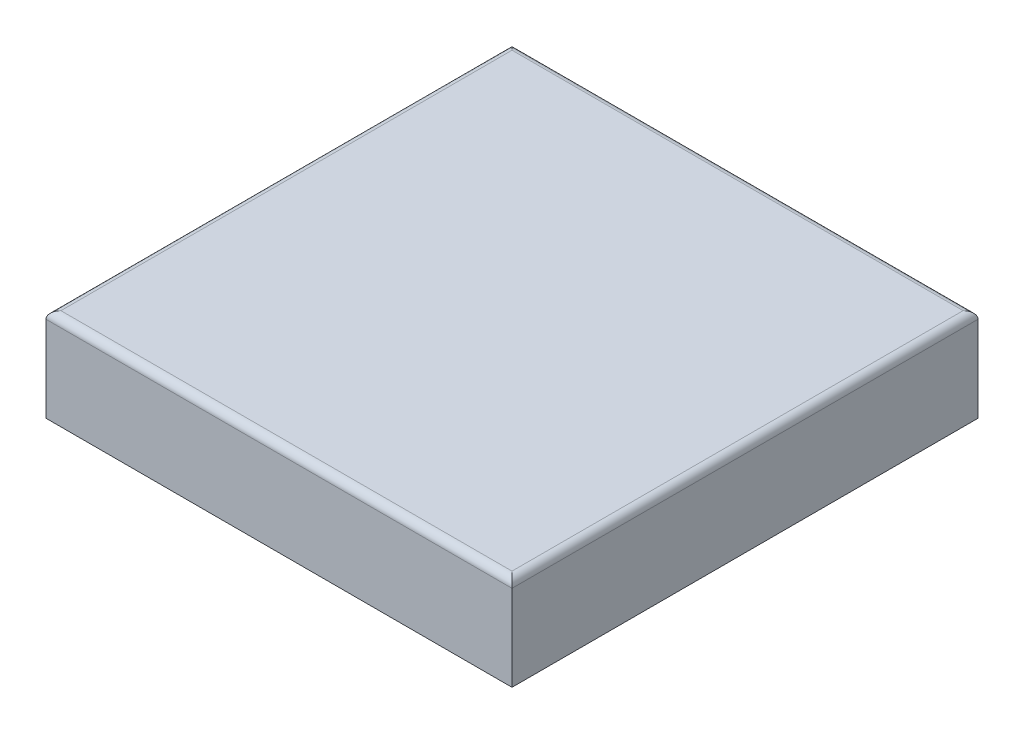
ISO-10303-21;
HEADER;
FILE_DESCRIPTION(('STEP AP214'),'2;1');
FILE_NAME('part.step','',(''),(''),'','','');
FILE_SCHEMA(('AUTOMOTIVE_DESIGN { 1 0 10303 214 1 1 1 1 }'));
ENDSEC;
DATA;
#1=APPLICATION_CONTEXT('core data for automotive mechanical design processes');
#2=APPLICATION_PROTOCOL_DEFINITION('international standard','automotive_design',2000,#1);
#3=PRODUCT_CONTEXT('',#1,'mechanical');
#4=PRODUCT('Part','Part','',(#3));
#5=PRODUCT_RELATED_PRODUCT_CATEGORY('part','',(#4));
#6=PRODUCT_DEFINITION_FORMATION('','',#4);
#7=PRODUCT_DEFINITION_CONTEXT('part definition',#1,'design');
#8=PRODUCT_DEFINITION('design','',#6,#7);
#9=PRODUCT_DEFINITION_SHAPE('','',#8);
#10=(LENGTH_UNIT() NAMED_UNIT(*) SI_UNIT(.MILLI.,.METRE.));
#11=(NAMED_UNIT(*) PLANE_ANGLE_UNIT() SI_UNIT($,.RADIAN.));
#12=(NAMED_UNIT(*) SI_UNIT($,.STERADIAN.) SOLID_ANGLE_UNIT());
#13=UNCERTAINTY_MEASURE_WITH_UNIT(LENGTH_MEASURE(1.E-05),#10,'distance_accuracy_value','');
#14=(GEOMETRIC_REPRESENTATION_CONTEXT(3) GLOBAL_UNCERTAINTY_ASSIGNED_CONTEXT((#13)) GLOBAL_UNIT_ASSIGNED_CONTEXT((#10,
#11,#12)) REPRESENTATION_CONTEXT('',''));
#15=CARTESIAN_POINT('',(0.,0.,0.));
#16=DIRECTION('',(0.,0.,1.));
#17=DIRECTION('',(1.,0.,0.));
#18=AXIS2_PLACEMENT_3D('',#15,#16,#17);
#19=CARTESIAN_POINT('',(-7.9375,1.5875,7.9375));
#20=DIRECTION('',(0.,-1.,0.));
#21=DIRECTION('',(0.,0.,-1.));
#22=AXIS2_PLACEMENT_3D('',#19,#20,#21);
#23=PLANE('',#22);
#24=CARTESIAN_POINT('',(-3.81000000000005,1.5875,0.));
#25=DIRECTION('',(0.,-1.,0.));
#26=DIRECTION('',(0.,0.,-1.));
#27=AXIS2_PLACEMENT_3D('',#24,#25,#26);
#28=CIRCLE('',#27,1.27);
#29=CARTESIAN_POINT('',(-3.81000000000005,1.5875,1.27));
#30=VERTEX_POINT('',#29);
#31=EDGE_CURVE('E237',#30,#30,#28,.T.);
#32=ORIENTED_EDGE('',*,*,#31,.F.);
#33=EDGE_LOOP('',(#32));
#34=FACE_BOUND('',#33,.T.);
#35=DIRECTION('',(0.,0.,1.));
#36=VECTOR('',#35,1.);
#37=CARTESIAN_POINT('',(-6.35,1.5875,7.9375));
#38=LINE('',#37,#36);
#39=CARTESIAN_POINT('',(-6.35,1.5875,-6.35));
#40=VERTEX_POINT('',#39);
#41=CARTESIAN_POINT('',(-6.35,1.5875,6.35));
#42=VERTEX_POINT('',#41);
#43=EDGE_CURVE('E119',#40,#42,#38,.T.);
#44=ORIENTED_EDGE('',*,*,#43,.F.);
#45=DIRECTION('',(1.,0.,0.));
#46=VECTOR('',#45,1.);
#47=CARTESIAN_POINT('',(-7.9375,1.5875,-6.35));
#48=LINE('',#47,#46);
#49=CARTESIAN_POINT('',(6.35,1.5875,-6.35));
#50=VERTEX_POINT('',#49);
#51=EDGE_CURVE('E147',#40,#50,#48,.T.);
#52=ORIENTED_EDGE('',*,*,#51,.T.);
#53=DIRECTION('',(0.,0.,-1.));
#54=VECTOR('',#53,1.);
#55=CARTESIAN_POINT('',(6.35,1.5875,7.9375));
#56=LINE('',#55,#54);
#57=CARTESIAN_POINT('',(6.35,1.5875,6.35));
#58=VERTEX_POINT('',#57);
#59=EDGE_CURVE('E145',#58,#50,#56,.T.);
#60=ORIENTED_EDGE('',*,*,#59,.F.);
#61=DIRECTION('',(-1.,0.,0.));
#62=VECTOR('',#61,1.);
#63=CARTESIAN_POINT('',(-7.9375,1.5875,6.35));
#64=LINE('',#63,#62);
#65=EDGE_CURVE('E130',#58,#42,#64,.T.);
#66=ORIENTED_EDGE('',*,*,#65,.T.);
#67=EDGE_LOOP('',(#44,#52,#60,#66));
#68=FACE_BOUND('',#67,.T.);
#69=CARTESIAN_POINT('',(0.,1.5875,3.80999999999999));
#70=DIRECTION('',(0.,-1.,0.));
#71=DIRECTION('',(0.,0.,-1.));
#72=AXIS2_PLACEMENT_3D('',#69,#70,#71);
#73=CIRCLE('',#72,1.27);
#74=CARTESIAN_POINT('',(0.,1.5875,5.07999999999999));
#75=VERTEX_POINT('',#74);
#76=EDGE_CURVE('E231',#75,#75,#73,.T.);
#77=ORIENTED_EDGE('',*,*,#76,.F.);
#78=EDGE_LOOP('',(#77));
#79=FACE_BOUND('',#78,.T.);
#80=ADVANCED_FACE('F44',(#34,#68,#79),#23,.T.);
#81=CARTESIAN_POINT('',(-7.9375,0.,7.9375));
#82=DIRECTION('',(0.,-1.,0.));
#83=DIRECTION('',(0.,0.,-1.));
#84=AXIS2_PLACEMENT_3D('',#81,#82,#83);
#85=PLANE('',#84);
#86=DIRECTION('',(0.,0.,1.));
#87=VECTOR('',#86,1.);
#88=CARTESIAN_POINT('',(-7.9375,0.,-7.9375));
#89=LINE('',#88,#87);
#90=CARTESIAN_POINT('',(-7.9375,0.,-7.9375));
#91=VERTEX_POINT('',#90);
#92=CARTESIAN_POINT('',(-7.9375,0.,7.9375));
#93=VERTEX_POINT('',#92);
#94=EDGE_CURVE('E140',#91,#93,#89,.T.);
#95=ORIENTED_EDGE('',*,*,#94,.F.);
#96=DIRECTION('',(1.,0.,0.));
#97=VECTOR('',#96,1.);
#98=CARTESIAN_POINT('',(-7.9375,0.,-7.9375));
#99=LINE('',#98,#97);
#100=CARTESIAN_POINT('',(7.9375,0.,-7.9375));
#101=VERTEX_POINT('',#100);
#102=EDGE_CURVE('E172',#91,#101,#99,.T.);
#103=ORIENTED_EDGE('',*,*,#102,.T.);
#104=DIRECTION('',(0.,0.,-1.));
#105=VECTOR('',#104,1.);
#106=CARTESIAN_POINT('',(7.9375,0.,7.9375));
#107=LINE('',#106,#105);
#108=CARTESIAN_POINT('',(7.9375,0.,7.9375));
#109=VERTEX_POINT('',#108);
#110=EDGE_CURVE('E169',#109,#101,#107,.T.);
#111=ORIENTED_EDGE('',*,*,#110,.F.);
#112=DIRECTION('',(-1.,0.,0.));
#113=VECTOR('',#112,1.);
#114=CARTESIAN_POINT('',(7.9375,0.,7.9375));
#115=LINE('',#114,#113);
#116=EDGE_CURVE('E166',#109,#93,#115,.T.);
#117=ORIENTED_EDGE('',*,*,#116,.T.);
#118=EDGE_LOOP('',(#95,#103,#111,#117));
#119=FACE_BOUND('',#118,.T.);
#120=DIRECTION('',(1.,0.,0.));
#121=VECTOR('',#120,1.);
#122=CARTESIAN_POINT('',(-7.9375,0.,-6.35));
#123=LINE('',#122,#121);
#124=CARTESIAN_POINT('',(-6.35,0.,-6.35));
#125=VERTEX_POINT('',#124);
#126=CARTESIAN_POINT('',(6.35,0.,-6.35));
#127=VERTEX_POINT('',#126);
#128=EDGE_CURVE('E131',#125,#127,#123,.T.);
#129=ORIENTED_EDGE('',*,*,#128,.F.);
#130=DIRECTION('',(0.,0.,1.));
#131=VECTOR('',#130,1.);
#132=CARTESIAN_POINT('',(-6.35,0.,7.9375));
#133=LINE('',#132,#131);
#134=CARTESIAN_POINT('',(-6.35,0.,6.35));
#135=VERTEX_POINT('',#134);
#136=EDGE_CURVE('E155',#125,#135,#133,.T.);
#137=ORIENTED_EDGE('',*,*,#136,.T.);
#138=DIRECTION('',(-1.,0.,0.));
#139=VECTOR('',#138,1.);
#140=CARTESIAN_POINT('',(-7.9375,0.,6.35));
#141=LINE('',#140,#139);
#142=CARTESIAN_POINT('',(6.35,0.,6.35));
#143=VERTEX_POINT('',#142);
#144=EDGE_CURVE('E138',#143,#135,#141,.T.);
#145=ORIENTED_EDGE('',*,*,#144,.F.);
#146=DIRECTION('',(0.,0.,-1.));
#147=VECTOR('',#146,1.);
#148=CARTESIAN_POINT('',(6.35,0.,7.9375));
#149=LINE('',#148,#147);
#150=EDGE_CURVE('E160',#143,#127,#149,.T.);
#151=ORIENTED_EDGE('',*,*,#150,.T.);
#152=EDGE_LOOP('',(#129,#137,#145,#151));
#153=FACE_BOUND('',#152,.T.);
#154=ADVANCED_FACE('F246',(#119,#153),#85,.T.);
#155=CARTESIAN_POINT('',(-7.9375,3.175,-7.9375));
#156=DIRECTION('',(1.,0.,0.));
#157=DIRECTION('',(0.,0.,-1.));
#158=AXIS2_PLACEMENT_3D('',#155,#156,#157);
#159=PLANE('',#158);
#160=DIRECTION('',(0.,-1.,0.));
#161=VECTOR('',#160,1.);
#162=CARTESIAN_POINT('',(-7.9375,3.175,7.9375));
#163=LINE('',#162,#161);
#164=CARTESIAN_POINT('',(-7.9375,2.921,7.9375));
#165=VERTEX_POINT('',#164);
#166=EDGE_CURVE('E181',#165,#93,#163,.T.);
#167=ORIENTED_EDGE('',*,*,#166,.F.);
#168=DIRECTION('',(0.,0.,1.));
#169=VECTOR('',#168,1.);
#170=CARTESIAN_POINT('',(-7.9375,2.921,-7.9375));
#171=LINE('',#170,#169);
#172=CARTESIAN_POINT('',(-7.9375,2.921,-7.9375));
#173=VERTEX_POINT('',#172);
#174=EDGE_CURVE('E11',#165,#173,#171,.F.);
#175=ORIENTED_EDGE('',*,*,#174,.T.);
#176=DIRECTION('',(0.,-1.,0.));
#177=VECTOR('',#176,1.);
#178=CARTESIAN_POINT('',(-7.9375,3.175,-7.9375));
#179=LINE('',#178,#177);
#180=EDGE_CURVE('E175',#173,#91,#179,.T.);
#181=ORIENTED_EDGE('',*,*,#180,.T.);
#182=ORIENTED_EDGE('',*,*,#94,.T.);
#183=EDGE_LOOP('',(#167,#175,#181,#182));
#184=FACE_BOUND('',#183,.T.);
#185=ADVANCED_FACE('F46',(#184),#159,.F.);
#186=CARTESIAN_POINT('',(7.9375,3.175,7.9375));
#187=DIRECTION('',(0.,0.,1.));
#188=DIRECTION('',(1.,0.,0.));
#189=AXIS2_PLACEMENT_3D('',#186,#187,#188);
#190=PLANE('',#189);
#191=DIRECTION('',(0.,-1.,0.));
#192=VECTOR('',#191,1.);
#193=CARTESIAN_POINT('',(7.9375,3.175,7.9375));
#194=LINE('',#193,#192);
#195=CARTESIAN_POINT('',(7.9375,2.921,7.9375));
#196=VERTEX_POINT('',#195);
#197=EDGE_CURVE('E179',#196,#109,#194,.T.);
#198=ORIENTED_EDGE('',*,*,#197,.F.);
#199=DIRECTION('',(-1.,0.,0.));
#200=VECTOR('',#199,1.);
#201=CARTESIAN_POINT('',(-7.9375,2.921,7.9375));
#202=LINE('',#201,#200);
#203=EDGE_CURVE('E52',#196,#165,#202,.T.);
#204=ORIENTED_EDGE('',*,*,#203,.T.);
#205=ORIENTED_EDGE('',*,*,#166,.T.);
#206=ORIENTED_EDGE('',*,*,#116,.F.);
#207=EDGE_LOOP('',(#198,#204,#205,#206));
#208=FACE_BOUND('',#207,.T.);
#209=ADVANCED_FACE('F276',(#208),#190,.T.);
#210=CARTESIAN_POINT('',(7.9375,3.175,7.9375));
#211=DIRECTION('',(-1.,0.,0.));
#212=DIRECTION('',(0.,0.,1.));
#213=AXIS2_PLACEMENT_3D('',#210,#211,#212);
#214=PLANE('',#213);
#215=DIRECTION('',(0.,-1.,0.));
#216=VECTOR('',#215,1.);
#217=CARTESIAN_POINT('',(7.9375,3.175,-7.9375));
#218=LINE('',#217,#216);
#219=CARTESIAN_POINT('',(7.9375,2.921,-7.9375));
#220=VERTEX_POINT('',#219);
#221=EDGE_CURVE('E177',#220,#101,#218,.T.);
#222=ORIENTED_EDGE('',*,*,#221,.F.);
#223=DIRECTION('',(0.,0.,-1.));
#224=VECTOR('',#223,1.);
#225=CARTESIAN_POINT('',(7.9375,2.921,7.9375));
#226=LINE('',#225,#224);
#227=EDGE_CURVE('E66',#220,#196,#226,.F.);
#228=ORIENTED_EDGE('',*,*,#227,.T.);
#229=ORIENTED_EDGE('',*,*,#197,.T.);
#230=ORIENTED_EDGE('',*,*,#110,.T.);
#231=EDGE_LOOP('',(#222,#228,#229,#230));
#232=FACE_BOUND('',#231,.T.);
#233=ADVANCED_FACE('F273',(#232),#214,.F.);
#234=CARTESIAN_POINT('',(-7.9375,3.175,-7.9375));
#235=DIRECTION('',(0.,0.,-1.));
#236=DIRECTION('',(-1.,0.,0.));
#237=AXIS2_PLACEMENT_3D('',#234,#235,#236);
#238=PLANE('',#237);
#239=ORIENTED_EDGE('',*,*,#180,.F.);
#240=DIRECTION('',(1.,0.,0.));
#241=VECTOR('',#240,1.);
#242=CARTESIAN_POINT('',(7.9375,2.921,-7.9375));
#243=LINE('',#242,#241);
#244=EDGE_CURVE('E183',#173,#220,#243,.T.);
#245=ORIENTED_EDGE('',*,*,#244,.T.);
#246=ORIENTED_EDGE('',*,*,#221,.T.);
#247=ORIENTED_EDGE('',*,*,#102,.F.);
#248=EDGE_LOOP('',(#239,#245,#246,#247));
#249=FACE_BOUND('',#248,.T.);
#250=ADVANCED_FACE('F270',(#249),#238,.T.);
#251=CARTESIAN_POINT('',(-7.9375,3.175,7.9375));
#252=DIRECTION('',(0.,-1.,0.));
#253=DIRECTION('',(0.,0.,-1.));
#254=AXIS2_PLACEMENT_3D('',#251,#252,#253);
#255=PLANE('',#254);
#256=DIRECTION('',(0.,0.,-1.));
#257=VECTOR('',#256,1.);
#258=CARTESIAN_POINT('',(7.6835,3.175,7.9375));
#259=LINE('',#258,#257);
#260=CARTESIAN_POINT('',(7.6835,3.175,7.6835));
#261=VERTEX_POINT('',#260);
#262=CARTESIAN_POINT('',(7.6835,3.175,-7.6835));
#263=VERTEX_POINT('',#262);
#264=EDGE_CURVE('E190',#261,#263,#259,.T.);
#265=ORIENTED_EDGE('',*,*,#264,.T.);
#266=DIRECTION('',(1.,0.,0.));
#267=VECTOR('',#266,1.);
#268=CARTESIAN_POINT('',(-7.9375,3.175,-7.6835));
#269=LINE('',#268,#267);
#270=CARTESIAN_POINT('',(-7.6835,3.175,-7.6835));
#271=VERTEX_POINT('',#270);
#272=EDGE_CURVE('E192',#263,#271,#269,.F.);
#273=ORIENTED_EDGE('',*,*,#272,.T.);
#274=DIRECTION('',(0.,0.,1.));
#275=VECTOR('',#274,1.);
#276=CARTESIAN_POINT('',(-7.6835,3.175,7.9375));
#277=LINE('',#276,#275);
#278=CARTESIAN_POINT('',(-7.6835,3.175,7.6835));
#279=VERTEX_POINT('',#278);
#280=EDGE_CURVE('E186',#271,#279,#277,.T.);
#281=ORIENTED_EDGE('',*,*,#280,.T.);
#282=DIRECTION('',(-1.,0.,0.));
#283=VECTOR('',#282,1.);
#284=CARTESIAN_POINT('',(7.9375,3.175,7.6835));
#285=LINE('',#284,#283);
#286=EDGE_CURVE('E188',#279,#261,#285,.F.);
#287=ORIENTED_EDGE('',*,*,#286,.T.);
#288=EDGE_LOOP('',(#265,#273,#281,#287));
#289=FACE_BOUND('',#288,.T.);
#290=ADVANCED_FACE('F197',(#289),#255,.F.);
#291=CARTESIAN_POINT('',(-6.35,3.175,-7.9375));
#292=DIRECTION('',(1.,0.,0.));
#293=DIRECTION('',(0.,0.,-1.));
#294=AXIS2_PLACEMENT_3D('',#291,#292,#293);
#295=PLANE('',#294);
#296=ORIENTED_EDGE('',*,*,#136,.F.);
#297=DIRECTION('',(0.,-1.,0.));
#298=VECTOR('',#297,1.);
#299=CARTESIAN_POINT('',(-6.35,3.175,-6.35));
#300=LINE('',#299,#298);
#301=EDGE_CURVE('E125',#40,#125,#300,.T.);
#302=ORIENTED_EDGE('',*,*,#301,.F.);
#303=ORIENTED_EDGE('',*,*,#43,.T.);
#304=DIRECTION('',(0.,-1.,0.));
#305=VECTOR('',#304,1.);
#306=CARTESIAN_POINT('',(-6.35,3.175,6.35));
#307=LINE('',#306,#305);
#308=EDGE_CURVE('E123',#42,#135,#307,.T.);
#309=ORIENTED_EDGE('',*,*,#308,.T.);
#310=EDGE_LOOP('',(#296,#302,#303,#309));
#311=FACE_BOUND('',#310,.T.);
#312=ADVANCED_FACE('F122',(#311),#295,.T.);
#313=CARTESIAN_POINT('',(7.9375,3.175,6.35));
#314=DIRECTION('',(0.,0.,1.));
#315=DIRECTION('',(1.,0.,0.));
#316=AXIS2_PLACEMENT_3D('',#313,#314,#315);
#317=PLANE('',#316);
#318=ORIENTED_EDGE('',*,*,#144,.T.);
#319=ORIENTED_EDGE('',*,*,#308,.F.);
#320=ORIENTED_EDGE('',*,*,#65,.F.);
#321=DIRECTION('',(0.,-1.,0.));
#322=VECTOR('',#321,1.);
#323=CARTESIAN_POINT('',(6.35,3.175,6.35));
#324=LINE('',#323,#322);
#325=EDGE_CURVE('E141',#58,#143,#324,.T.);
#326=ORIENTED_EDGE('',*,*,#325,.T.);
#327=EDGE_LOOP('',(#318,#319,#320,#326));
#328=FACE_BOUND('',#327,.T.);
#329=ADVANCED_FACE('F135',(#328),#317,.F.);
#330=CARTESIAN_POINT('',(6.35,3.175,7.9375));
#331=DIRECTION('',(-1.,0.,0.));
#332=DIRECTION('',(0.,0.,1.));
#333=AXIS2_PLACEMENT_3D('',#330,#331,#332);
#334=PLANE('',#333);
#335=ORIENTED_EDGE('',*,*,#150,.F.);
#336=ORIENTED_EDGE('',*,*,#325,.F.);
#337=ORIENTED_EDGE('',*,*,#59,.T.);
#338=DIRECTION('',(0.,-1.,0.));
#339=VECTOR('',#338,1.);
#340=CARTESIAN_POINT('',(6.35,3.175,-6.35));
#341=LINE('',#340,#339);
#342=EDGE_CURVE('E152',#50,#127,#341,.T.);
#343=ORIENTED_EDGE('',*,*,#342,.T.);
#344=EDGE_LOOP('',(#335,#336,#337,#343));
#345=FACE_BOUND('',#344,.T.);
#346=ADVANCED_FACE('F248',(#345),#334,.T.);
#347=CARTESIAN_POINT('',(-7.9375,3.175,-6.35));
#348=DIRECTION('',(0.,0.,-1.));
#349=DIRECTION('',(-1.,0.,0.));
#350=AXIS2_PLACEMENT_3D('',#347,#348,#349);
#351=PLANE('',#350);
#352=ORIENTED_EDGE('',*,*,#128,.T.);
#353=ORIENTED_EDGE('',*,*,#342,.F.);
#354=ORIENTED_EDGE('',*,*,#51,.F.);
#355=ORIENTED_EDGE('',*,*,#301,.T.);
#356=EDGE_LOOP('',(#352,#353,#354,#355));
#357=FACE_BOUND('',#356,.T.);
#358=ADVANCED_FACE('F242',(#357),#351,.F.);
#359=CARTESIAN_POINT('',(-3.81000000000005,-3.59210244842766,0.));
#360=DIRECTION('',(0.,1.,0.));
#361=DIRECTION('',(0.,0.,1.));
#362=AXIS2_PLACEMENT_3D('',#359,#360,#361);
#363=CYLINDRICAL_SURFACE('',#362,1.27);
#364=CARTESIAN_POINT('',(-3.81000000000005,0.,0.));
#365=DIRECTION('',(0.,-1.,0.));
#366=DIRECTION('',(0.,0.,-1.));
#367=AXIS2_PLACEMENT_3D('',#364,#365,#366);
#368=CIRCLE('',#367,1.27);
#369=CARTESIAN_POINT('',(-3.81000000000005,0.,1.27));
#370=VERTEX_POINT('',#369);
#371=EDGE_CURVE('E157',#370,#370,#368,.T.);
#372=CARTESIAN_POINT('',(-3.81000000000005,1.5875,1.27));
#373=CARTESIAN_POINT('',(-3.81000000000005,1.57096354166667,1.27));
#374=CARTESIAN_POINT('',(-3.81000000000005,1.55442708333333,1.27));
#375=CARTESIAN_POINT('',(-3.81000000000005,1.52135416666667,1.27));
#376=CARTESIAN_POINT('',(-3.81000000000005,1.50481770833333,1.27));
#377=CARTESIAN_POINT('',(-3.81000000000005,1.47174479166667,1.27));
#378=CARTESIAN_POINT('',(-3.81000000000005,1.45520833333333,1.27));
#379=CARTESIAN_POINT('',(-3.81000000000005,1.42213541666667,1.27));
#380=CARTESIAN_POINT('',(-3.81000000000005,1.40559895833333,1.27));
#381=CARTESIAN_POINT('',(-3.81000000000005,1.37252604166667,1.27));
#382=CARTESIAN_POINT('',(-3.81000000000005,1.35598958333333,1.27));
#383=CARTESIAN_POINT('',(-3.81000000000005,1.32291666666667,1.27));
#384=CARTESIAN_POINT('',(-3.81000000000005,1.30638020833333,1.27));
#385=CARTESIAN_POINT('',(-3.81000000000005,1.27330729166667,1.27));
#386=CARTESIAN_POINT('',(-3.81000000000005,1.25677083333333,1.27));
#387=CARTESIAN_POINT('',(-3.81000000000005,1.22369791666667,1.27));
#388=CARTESIAN_POINT('',(-3.81000000000005,1.20716145833333,1.27));
#389=CARTESIAN_POINT('',(-3.81000000000005,1.17408854166667,1.27));
#390=CARTESIAN_POINT('',(-3.81000000000005,1.15755208333333,1.27));
#391=CARTESIAN_POINT('',(-3.81000000000005,1.12447916666667,1.27));
#392=CARTESIAN_POINT('',(-3.81000000000005,1.10794270833333,1.27));
#393=CARTESIAN_POINT('',(-3.81000000000005,1.07486979166667,1.27));
#394=CARTESIAN_POINT('',(-3.81000000000005,1.05833333333333,1.27));
#395=CARTESIAN_POINT('',(-3.81000000000005,1.02526041666667,1.27));
#396=CARTESIAN_POINT('',(-3.81000000000005,1.00872395833333,1.27));
#397=CARTESIAN_POINT('',(-3.81000000000005,0.975651041666667,1.27));
#398=CARTESIAN_POINT('',(-3.81000000000005,0.959114583333333,1.27));
#399=CARTESIAN_POINT('',(-3.81000000000005,0.926041666666667,1.27));
#400=CARTESIAN_POINT('',(-3.81000000000005,0.909505208333333,1.27));
#401=CARTESIAN_POINT('',(-3.81000000000005,0.876432291666667,1.27));
#402=CARTESIAN_POINT('',(-3.81000000000005,0.859895833333334,1.27));
#403=CARTESIAN_POINT('',(-3.81000000000005,0.826822916666667,1.27));
#404=CARTESIAN_POINT('',(-3.81000000000005,0.810286458333333,1.27));
#405=CARTESIAN_POINT('',(-3.81000000000005,0.777213541666666,1.27));
#406=CARTESIAN_POINT('',(-3.81000000000005,0.760677083333333,1.27));
#407=CARTESIAN_POINT('',(-3.81000000000005,0.727604166666667,1.27));
#408=CARTESIAN_POINT('',(-3.81000000000005,0.711067708333334,1.27));
#409=CARTESIAN_POINT('',(-3.81000000000005,0.677994791666667,1.27));
#410=CARTESIAN_POINT('',(-3.81000000000005,0.661458333333333,1.27));
#411=CARTESIAN_POINT('',(-3.81000000000005,0.628385416666666,1.27));
#412=CARTESIAN_POINT('',(-3.81000000000005,0.611848958333333,1.27));
#413=CARTESIAN_POINT('',(-3.81000000000005,0.578776041666667,1.27));
#414=CARTESIAN_POINT('',(-3.81000000000005,0.562239583333333,1.27));
#415=CARTESIAN_POINT('',(-3.81000000000005,0.529166666666667,1.27));
#416=CARTESIAN_POINT('',(-3.81000000000005,0.512630208333333,1.27));
#417=CARTESIAN_POINT('',(-3.81000000000005,0.479557291666666,1.27));
#418=CARTESIAN_POINT('',(-3.81000000000005,0.463020833333333,1.27));
#419=CARTESIAN_POINT('',(-3.81000000000005,0.429947916666667,1.27));
#420=CARTESIAN_POINT('',(-3.81000000000005,0.413411458333333,1.27));
#421=CARTESIAN_POINT('',(-3.81000000000005,0.380338541666667,1.27));
#422=CARTESIAN_POINT('',(-3.81000000000005,0.363802083333333,1.27));
#423=CARTESIAN_POINT('',(-3.81000000000005,0.330729166666666,1.27));
#424=CARTESIAN_POINT('',(-3.81000000000005,0.314192708333333,1.27));
#425=CARTESIAN_POINT('',(-3.81000000000005,0.281119791666667,1.27));
#426=CARTESIAN_POINT('',(-3.81000000000005,0.264583333333334,1.27));
#427=CARTESIAN_POINT('',(-3.81000000000005,0.231510416666667,1.27));
#428=CARTESIAN_POINT('',(-3.81000000000005,0.214973958333334,1.27));
#429=CARTESIAN_POINT('',(-3.81000000000005,0.181901041666667,1.27));
#430=CARTESIAN_POINT('',(-3.81000000000005,0.165364583333333,1.27));
#431=CARTESIAN_POINT('',(-3.81000000000005,0.132291666666667,1.27));
#432=CARTESIAN_POINT('',(-3.81000000000005,0.115755208333334,1.27));
#433=CARTESIAN_POINT('',(-3.81000000000005,0.0826822916666668,1.27));
#434=CARTESIAN_POINT('',(-3.81000000000005,0.0661458333333333,1.27));
#435=CARTESIAN_POINT('',(-3.81000000000005,0.0330729166666665,1.27));
#436=CARTESIAN_POINT('',(-3.81000000000005,0.0165364583333332,1.27));
#437=CARTESIAN_POINT('',(-3.81000000000005,0.,1.27));
#438=B_SPLINE_CURVE_WITH_KNOTS('',3,(#372,#373,#374,#375,#376,#377,#378,#379,#380,#381,#382,
#383,#384,#385,#386,#387,#388,#389,#390,#391,#392,#393,#394,#395,#396,#397,#398,#399,#400,#401,
#402,#403,#404,#405,#406,#407,#408,#409,#410,#411,#412,#413,#414,#415,#416,#417,#418,#419,#420,
#421,#422,#423,#424,#425,#426,#427,#428,#429,#430,#431,#432,#433,#434,#435,#436,#437),
.UNSPECIFIED.,.F.,.F.,(4,2,2,2,2,2,2,2,2,2,2,2,2,2,2,2,2,2,2,2,2,2,2,2,2,2,2,2,2,2,2,2,4),(0.,
0.0496093749999997,0.0992187500000004,0.148828125,0.1984375,0.248046875,0.29765625,0.347265625,
0.396875000000001,0.446484375,0.496093750000001,0.545703125000001,0.5953125,0.644921875000001,
0.694531250000001,0.744140625,0.793750000000001,0.843359375000001,0.892968750000001,
0.942578125000001,0.992187500000001,1.041796875,1.09140625,1.141015625,1.190625,1.240234375,
1.28984375,1.339453125,1.3890625,1.438671875,1.48828125,1.537890625,1.5875),.UNSPECIFIED.);
#439=EDGE_CURVE('BSEAM255',#30,#370,#438,.T.);
#440=ORIENTED_EDGE('',*,*,#31,.T.);
#441=ORIENTED_EDGE('',*,*,#371,.F.);
#442=ORIENTED_EDGE('',*,*,#439,.T.);
#443=ORIENTED_EDGE('',*,*,#439,.F.);
#444=EDGE_LOOP('',(#440,#442,#441,#443));
#445=FACE_BOUND('',#444,.T.);
#446=ADVANCED_FACE('F255',(#445),#363,.T.);
#447=CARTESIAN_POINT('',(-7.9375,0.,7.9375));
#448=DIRECTION('',(0.,-1.,0.));
#449=DIRECTION('',(0.,0.,-1.));
#450=AXIS2_PLACEMENT_3D('',#447,#448,#449);
#451=PLANE('',#450);
#452=CARTESIAN_POINT('',(-3.81000000000005,0.,0.));
#453=DIRECTION('',(0.,-1.,0.));
#454=DIRECTION('',(0.,0.,-1.));
#455=AXIS2_PLACEMENT_3D('',#452,#453,#454);
#456=CIRCLE('',#455,0.635);
#457=CARTESIAN_POINT('',(-3.81000000000005,0.,-0.635));
#458=VERTEX_POINT('',#457);
#459=EDGE_CURVE('E219',#458,#458,#456,.T.);
#460=ORIENTED_EDGE('',*,*,#459,.F.);
#461=EDGE_LOOP('',(#460));
#462=FACE_BOUND('',#461,.T.);
#463=ORIENTED_EDGE('',*,*,#371,.T.);
#464=EDGE_LOOP('',(#463));
#465=FACE_BOUND('',#464,.T.);
#466=ADVANCED_FACE('F324',(#462,#465),#451,.T.);
#467=CARTESIAN_POINT('',(0.,-3.59210244842766,3.80999999999999));
#468=DIRECTION('',(0.,1.,0.));
#469=DIRECTION('',(0.,0.,1.));
#470=AXIS2_PLACEMENT_3D('',#467,#468,#469);
#471=CYLINDRICAL_SURFACE('',#470,1.27);
#472=CARTESIAN_POINT('',(0.,0.,3.80999999999999));
#473=DIRECTION('',(0.,-1.,0.));
#474=DIRECTION('',(0.,0.,-1.));
#475=AXIS2_PLACEMENT_3D('',#472,#473,#474);
#476=CIRCLE('',#475,1.27);
#477=CARTESIAN_POINT('',(0.,0.,5.07999999999999));
#478=VERTEX_POINT('',#477);
#479=EDGE_CURVE('E234',#478,#478,#476,.T.);
#480=CARTESIAN_POINT('',(0.,1.5875,5.07999999999999));
#481=CARTESIAN_POINT('',(0.,1.57096354166667,5.07999999999999));
#482=CARTESIAN_POINT('',(0.,1.55442708333333,5.07999999999999));
#483=CARTESIAN_POINT('',(0.,1.52135416666667,5.07999999999999));
#484=CARTESIAN_POINT('',(0.,1.50481770833333,5.07999999999999));
#485=CARTESIAN_POINT('',(0.,1.47174479166667,5.07999999999999));
#486=CARTESIAN_POINT('',(0.,1.45520833333333,5.07999999999999));
#487=CARTESIAN_POINT('',(0.,1.42213541666667,5.07999999999999));
#488=CARTESIAN_POINT('',(0.,1.40559895833333,5.07999999999999));
#489=CARTESIAN_POINT('',(0.,1.37252604166667,5.07999999999999));
#490=CARTESIAN_POINT('',(0.,1.35598958333333,5.07999999999999));
#491=CARTESIAN_POINT('',(0.,1.32291666666667,5.07999999999999));
#492=CARTESIAN_POINT('',(0.,1.30638020833333,5.07999999999999));
#493=CARTESIAN_POINT('',(0.,1.27330729166667,5.07999999999999));
#494=CARTESIAN_POINT('',(0.,1.25677083333333,5.07999999999999));
#495=CARTESIAN_POINT('',(0.,1.22369791666667,5.07999999999999));
#496=CARTESIAN_POINT('',(0.,1.20716145833333,5.07999999999999));
#497=CARTESIAN_POINT('',(0.,1.17408854166667,5.07999999999999));
#498=CARTESIAN_POINT('',(0.,1.15755208333333,5.07999999999999));
#499=CARTESIAN_POINT('',(0.,1.12447916666667,5.07999999999999));
#500=CARTESIAN_POINT('',(0.,1.10794270833333,5.07999999999999));
#501=CARTESIAN_POINT('',(0.,1.07486979166667,5.07999999999999));
#502=CARTESIAN_POINT('',(0.,1.05833333333333,5.07999999999999));
#503=CARTESIAN_POINT('',(0.,1.02526041666667,5.07999999999999));
#504=CARTESIAN_POINT('',(0.,1.00872395833333,5.07999999999999));
#505=CARTESIAN_POINT('',(0.,0.975651041666667,5.07999999999999));
#506=CARTESIAN_POINT('',(0.,0.959114583333333,5.07999999999999));
#507=CARTESIAN_POINT('',(0.,0.926041666666667,5.07999999999999));
#508=CARTESIAN_POINT('',(0.,0.909505208333333,5.07999999999999));
#509=CARTESIAN_POINT('',(0.,0.876432291666667,5.07999999999999));
#510=CARTESIAN_POINT('',(0.,0.859895833333334,5.07999999999999));
#511=CARTESIAN_POINT('',(0.,0.826822916666667,5.07999999999999));
#512=CARTESIAN_POINT('',(0.,0.810286458333333,5.07999999999999));
#513=CARTESIAN_POINT('',(0.,0.777213541666666,5.07999999999999));
#514=CARTESIAN_POINT('',(0.,0.760677083333333,5.07999999999999));
#515=CARTESIAN_POINT('',(0.,0.727604166666667,5.07999999999999));
#516=CARTESIAN_POINT('',(0.,0.711067708333334,5.07999999999999));
#517=CARTESIAN_POINT('',(0.,0.677994791666667,5.07999999999999));
#518=CARTESIAN_POINT('',(0.,0.661458333333333,5.07999999999999));
#519=CARTESIAN_POINT('',(0.,0.628385416666666,5.07999999999999));
#520=CARTESIAN_POINT('',(0.,0.611848958333333,5.07999999999999));
#521=CARTESIAN_POINT('',(0.,0.578776041666667,5.07999999999999));
#522=CARTESIAN_POINT('',(0.,0.562239583333333,5.07999999999999));
#523=CARTESIAN_POINT('',(0.,0.529166666666667,5.07999999999999));
#524=CARTESIAN_POINT('',(0.,0.512630208333333,5.07999999999999));
#525=CARTESIAN_POINT('',(0.,0.479557291666666,5.07999999999999));
#526=CARTESIAN_POINT('',(0.,0.463020833333333,5.07999999999999));
#527=CARTESIAN_POINT('',(0.,0.429947916666667,5.07999999999999));
#528=CARTESIAN_POINT('',(0.,0.413411458333333,5.07999999999999));
#529=CARTESIAN_POINT('',(0.,0.380338541666667,5.07999999999999));
#530=CARTESIAN_POINT('',(0.,0.363802083333333,5.07999999999999));
#531=CARTESIAN_POINT('',(0.,0.330729166666666,5.07999999999999));
#532=CARTESIAN_POINT('',(0.,0.314192708333333,5.07999999999999));
#533=CARTESIAN_POINT('',(0.,0.281119791666667,5.07999999999999));
#534=CARTESIAN_POINT('',(0.,0.264583333333334,5.07999999999999));
#535=CARTESIAN_POINT('',(0.,0.231510416666667,5.07999999999999));
#536=CARTESIAN_POINT('',(0.,0.214973958333334,5.07999999999999));
#537=CARTESIAN_POINT('',(0.,0.181901041666667,5.07999999999999));
#538=CARTESIAN_POINT('',(0.,0.165364583333333,5.07999999999999));
#539=CARTESIAN_POINT('',(0.,0.132291666666667,5.07999999999999));
#540=CARTESIAN_POINT('',(0.,0.115755208333334,5.07999999999999));
#541=CARTESIAN_POINT('',(0.,0.0826822916666668,5.07999999999999));
#542=CARTESIAN_POINT('',(0.,0.0661458333333333,5.07999999999999));
#543=CARTESIAN_POINT('',(0.,0.0330729166666665,5.07999999999999));
#544=CARTESIAN_POINT('',(0.,0.0165364583333332,5.07999999999999));
#545=CARTESIAN_POINT('',(0.,0.,5.07999999999999));
#546=B_SPLINE_CURVE_WITH_KNOTS('',3,(#480,#481,#482,#483,#484,#485,#486,#487,#488,#489,#490,
#491,#492,#493,#494,#495,#496,#497,#498,#499,#500,#501,#502,#503,#504,#505,#506,#507,#508,#509,
#510,#511,#512,#513,#514,#515,#516,#517,#518,#519,#520,#521,#522,#523,#524,#525,#526,#527,#528,
#529,#530,#531,#532,#533,#534,#535,#536,#537,#538,#539,#540,#541,#542,#543,#544,#545),
.UNSPECIFIED.,.F.,.F.,(4,2,2,2,2,2,2,2,2,2,2,2,2,2,2,2,2,2,2,2,2,2,2,2,2,2,2,2,2,2,2,2,4),(0.,
0.0496093749999997,0.0992187500000004,0.148828125,0.1984375,0.248046875,0.29765625,0.347265625,
0.396875000000001,0.446484375,0.496093750000001,0.545703125000001,0.5953125,0.644921875000001,
0.694531250000001,0.744140625,0.793750000000001,0.843359375000001,0.892968750000001,
0.942578125000001,0.992187500000001,1.041796875,1.09140625,1.141015625,1.190625,1.240234375,
1.28984375,1.339453125,1.3890625,1.438671875,1.48828125,1.537890625,1.5875),.UNSPECIFIED.);
#547=EDGE_CURVE('BSEAM321',#75,#478,#546,.T.);
#548=ORIENTED_EDGE('',*,*,#76,.T.);
#549=ORIENTED_EDGE('',*,*,#479,.F.);
#550=ORIENTED_EDGE('',*,*,#547,.T.);
#551=ORIENTED_EDGE('',*,*,#547,.F.);
#552=EDGE_LOOP('',(#548,#550,#549,#551));
#553=FACE_BOUND('',#552,.T.);
#554=ADVANCED_FACE('F321',(#553),#471,.T.);
#555=CARTESIAN_POINT('',(-7.9375,0.,7.9375));
#556=DIRECTION('',(0.,-1.,0.));
#557=DIRECTION('',(0.,0.,-1.));
#558=AXIS2_PLACEMENT_3D('',#555,#556,#557);
#559=PLANE('',#558);
#560=CARTESIAN_POINT('',(0.,0.,3.80999999999999));
#561=DIRECTION('',(0.,-1.,0.));
#562=DIRECTION('',(0.,0.,-1.));
#563=AXIS2_PLACEMENT_3D('',#560,#561,#562);
#564=CIRCLE('',#563,0.635);
#565=CARTESIAN_POINT('',(0.,0.,3.17499999999999));
#566=VERTEX_POINT('',#565);
#567=EDGE_CURVE('E225',#566,#566,#564,.T.);
#568=ORIENTED_EDGE('',*,*,#567,.F.);
#569=EDGE_LOOP('',(#568));
#570=FACE_BOUND('',#569,.T.);
#571=ORIENTED_EDGE('',*,*,#479,.T.);
#572=EDGE_LOOP('',(#571));
#573=FACE_BOUND('',#572,.T.);
#574=ADVANCED_FACE('F319',(#570,#573),#559,.T.);
#575=CARTESIAN_POINT('',(0.,3.38355122421383,3.80999999999999));
#576=DIRECTION('',(0.,-1.,0.));
#577=DIRECTION('',(0.,0.,-1.));
#578=AXIS2_PLACEMENT_3D('',#575,#576,#577);
#579=CYLINDRICAL_SURFACE('',#578,0.635);
#580=CARTESIAN_POINT('',(0.,1.5875,3.80999999999999));
#581=DIRECTION('',(0.,-1.,0.));
#582=DIRECTION('',(0.,0.,-1.));
#583=AXIS2_PLACEMENT_3D('',#580,#581,#582);
#584=CIRCLE('',#583,0.635);
#585=CARTESIAN_POINT('',(0.,1.5875,3.17499999999999));
#586=VERTEX_POINT('',#585);
#587=EDGE_CURVE('E228',#586,#586,#584,.F.);
#588=ORIENTED_EDGE('',*,*,#587,.T.);
#589=EDGE_LOOP('',(#588));
#590=FACE_BOUND('',#589,.T.);
#591=ORIENTED_EDGE('',*,*,#567,.T.);
#592=EDGE_LOOP('',(#591));
#593=FACE_BOUND('',#592,.T.);
#594=ADVANCED_FACE('F315',(#590,#593),#579,.F.);
#595=CARTESIAN_POINT('',(-7.9375,1.5875,7.9375));
#596=DIRECTION('',(0.,-1.,0.));
#597=DIRECTION('',(0.,0.,-1.));
#598=AXIS2_PLACEMENT_3D('',#595,#596,#597);
#599=PLANE('',#598);
#600=ORIENTED_EDGE('',*,*,#587,.F.);
#601=EDGE_LOOP('',(#600));
#602=FACE_BOUND('',#601,.T.);
#603=ADVANCED_FACE('F311',(#602),#599,.T.);
#604=CARTESIAN_POINT('',(-3.81000000000005,3.38355122421383,0.));
#605=DIRECTION('',(0.,-1.,0.));
#606=DIRECTION('',(0.,0.,-1.));
#607=AXIS2_PLACEMENT_3D('',#604,#605,#606);
#608=CYLINDRICAL_SURFACE('',#607,0.635);
#609=CARTESIAN_POINT('',(-3.81000000000005,1.5875,0.));
#610=DIRECTION('',(0.,-1.,0.));
#611=DIRECTION('',(0.,0.,-1.));
#612=AXIS2_PLACEMENT_3D('',#609,#610,#611);
#613=CIRCLE('',#612,0.635);
#614=CARTESIAN_POINT('',(-3.81000000000005,1.5875,-0.635));
#615=VERTEX_POINT('',#614);
#616=EDGE_CURVE('E222',#615,#615,#613,.F.);
#617=ORIENTED_EDGE('',*,*,#616,.T.);
#618=EDGE_LOOP('',(#617));
#619=FACE_BOUND('',#618,.T.);
#620=ORIENTED_EDGE('',*,*,#459,.T.);
#621=EDGE_LOOP('',(#620));
#622=FACE_BOUND('',#621,.T.);
#623=ADVANCED_FACE('F307',(#619,#622),#608,.F.);
#624=CARTESIAN_POINT('',(-7.9375,1.5875,7.9375));
#625=DIRECTION('',(0.,-1.,0.));
#626=DIRECTION('',(0.,0.,-1.));
#627=AXIS2_PLACEMENT_3D('',#624,#625,#626);
#628=PLANE('',#627);
#629=ORIENTED_EDGE('',*,*,#616,.F.);
#630=EDGE_LOOP('',(#629));
#631=FACE_BOUND('',#630,.T.);
#632=ADVANCED_FACE('F301',(#631),#628,.T.);
#633=CARTESIAN_POINT('',(7.9375,2.921,7.6835));
#634=DIRECTION('',(1.,0.,0.));
#635=DIRECTION('',(0.,0.,-1.));
#636=AXIS2_PLACEMENT_3D('',#633,#634,#635);
#637=CYLINDRICAL_SURFACE('',#636,0.254);
#638=CARTESIAN_POINT('',(7.6835,2.921,7.6835));
#639=DIRECTION('',(0.707106781186547,0.,-0.707106781186547));
#640=DIRECTION('',(0.707106781186547,0.,0.707106781186547));
#641=AXIS2_PLACEMENT_3D('',#638,#639,#640);
#642=ELLIPSE('',#641,0.359210244842766,0.254);
#643=EDGE_CURVE('E212',#261,#196,#642,.T.);
#644=ORIENTED_EDGE('',*,*,#643,.F.);
#645=ORIENTED_EDGE('',*,*,#286,.F.);
#646=CARTESIAN_POINT('',(-7.6835,2.921,7.6835));
#647=DIRECTION('',(0.707106781186547,0.,0.707106781186547));
#648=DIRECTION('',(-0.707106781186547,0.,0.707106781186547));
#649=AXIS2_PLACEMENT_3D('',#646,#647,#648);
#650=ELLIPSE('',#649,0.359210244842766,0.254);
#651=EDGE_CURVE('E216',#165,#279,#650,.F.);
#652=ORIENTED_EDGE('',*,*,#651,.F.);
#653=ORIENTED_EDGE('',*,*,#203,.F.);
#654=EDGE_LOOP('',(#644,#645,#652,#653));
#655=FACE_BOUND('',#654,.T.);
#656=ADVANCED_FACE('F287',(#655),#637,.T.);
#657=CARTESIAN_POINT('',(-7.6835,2.921,7.9375));
#658=DIRECTION('',(0.,0.,1.));
#659=DIRECTION('',(1.,0.,0.));
#660=AXIS2_PLACEMENT_3D('',#657,#658,#659);
#661=CYLINDRICAL_SURFACE('',#660,0.254);
#662=ORIENTED_EDGE('',*,*,#651,.T.);
#663=ORIENTED_EDGE('',*,*,#280,.F.);
#664=CARTESIAN_POINT('',(-7.6835,2.921,-7.6835));
#665=DIRECTION('',(-0.707106781186547,0.,0.707106781186547));
#666=DIRECTION('',(0.707106781186547,0.,0.707106781186547));
#667=AXIS2_PLACEMENT_3D('',#664,#665,#666);
#668=ELLIPSE('',#667,0.359210244842766,0.254);
#669=EDGE_CURVE('E207',#173,#271,#668,.F.);
#670=ORIENTED_EDGE('',*,*,#669,.F.);
#671=ORIENTED_EDGE('',*,*,#174,.F.);
#672=EDGE_LOOP('',(#662,#663,#670,#671));
#673=FACE_BOUND('',#672,.T.);
#674=ADVANCED_FACE('F290',(#673),#661,.T.);
#675=CARTESIAN_POINT('',(7.6835,2.921,7.9375));
#676=DIRECTION('',(0.,0.,-1.));
#677=DIRECTION('',(-1.,0.,0.));
#678=AXIS2_PLACEMENT_3D('',#675,#676,#677);
#679=CYLINDRICAL_SURFACE('',#678,0.254);
#680=ORIENTED_EDGE('',*,*,#643,.T.);
#681=ORIENTED_EDGE('',*,*,#227,.F.);
#682=CARTESIAN_POINT('',(7.6835,2.921,-7.6835));
#683=DIRECTION('',(-0.707106781186547,0.,-0.707106781186547));
#684=DIRECTION('',(0.707106781186547,0.,-0.707106781186547));
#685=AXIS2_PLACEMENT_3D('',#682,#683,#684);
#686=ELLIPSE('',#685,0.359210244842766,0.254);
#687=EDGE_CURVE('E205',#263,#220,#686,.T.);
#688=ORIENTED_EDGE('',*,*,#687,.F.);
#689=ORIENTED_EDGE('',*,*,#264,.F.);
#690=EDGE_LOOP('',(#680,#681,#688,#689));
#691=FACE_BOUND('',#690,.T.);
#692=ADVANCED_FACE('F210',(#691),#679,.T.);
#693=CARTESIAN_POINT('',(-7.9375,2.921,-7.6835));
#694=DIRECTION('',(-1.,0.,0.));
#695=DIRECTION('',(0.,0.,1.));
#696=AXIS2_PLACEMENT_3D('',#693,#694,#695);
#697=CYLINDRICAL_SURFACE('',#696,0.254);
#698=ORIENTED_EDGE('',*,*,#669,.T.);
#699=ORIENTED_EDGE('',*,*,#272,.F.);
#700=ORIENTED_EDGE('',*,*,#687,.T.);
#701=ORIENTED_EDGE('',*,*,#244,.F.);
#702=EDGE_LOOP('',(#698,#699,#700,#701));
#703=FACE_BOUND('',#702,.T.);
#704=ADVANCED_FACE('F203',(#703),#697,.T.);
#705=CLOSED_SHELL('',(#80,#154,#185,#209,#233,#250,#290,#312,#329,#346,#358,#446,#466,#554,#574,
#594,#603,#623,#632,#656,#674,#692,#704));
#706=MANIFOLD_SOLID_BREP('B2',#705);
#707=ADVANCED_BREP_SHAPE_REPRESENTATION('',(#18,#706),#14);
#708=SHAPE_DEFINITION_REPRESENTATION(#9,#707);
ENDSEC;
END-ISO-10303-21;
